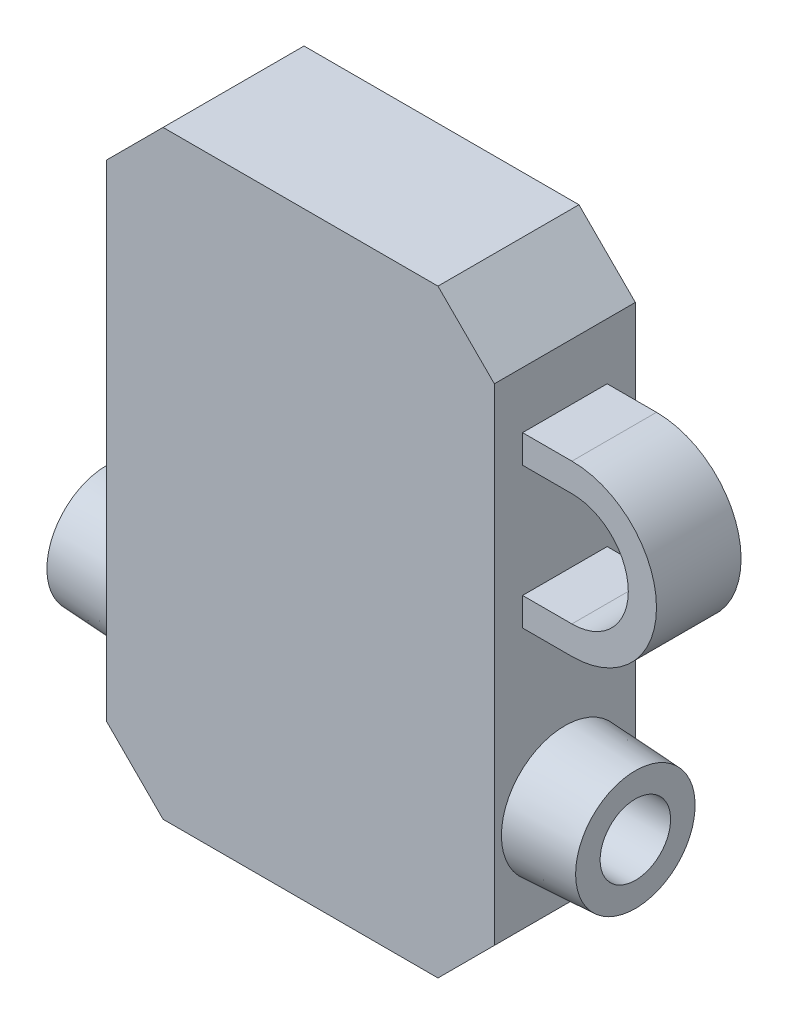
ISO-10303-21;
HEADER;
FILE_DESCRIPTION(('STEP AP214'),'2;1');
FILE_NAME('part.step','',(''),(''),'','','');
FILE_SCHEMA(('AUTOMOTIVE_DESIGN { 1 0 10303 214 1 1 1 1 }'));
ENDSEC;
DATA;
#1=APPLICATION_CONTEXT('core data for automotive mechanical design processes');
#2=APPLICATION_PROTOCOL_DEFINITION('international standard','automotive_design',2000,#1);
#3=PRODUCT_CONTEXT('',#1,'mechanical');
#4=PRODUCT('Part','Part','',(#3));
#5=PRODUCT_RELATED_PRODUCT_CATEGORY('part','',(#4));
#6=PRODUCT_DEFINITION_FORMATION('','',#4);
#7=PRODUCT_DEFINITION_CONTEXT('part definition',#1,'design');
#8=PRODUCT_DEFINITION('design','',#6,#7);
#9=PRODUCT_DEFINITION_SHAPE('','',#8);
#10=(LENGTH_UNIT() NAMED_UNIT(*) SI_UNIT(.MILLI.,.METRE.));
#11=(NAMED_UNIT(*) PLANE_ANGLE_UNIT() SI_UNIT($,.RADIAN.));
#12=(NAMED_UNIT(*) SI_UNIT($,.STERADIAN.) SOLID_ANGLE_UNIT());
#13=UNCERTAINTY_MEASURE_WITH_UNIT(LENGTH_MEASURE(1.E-05),#10,'distance_accuracy_value','');
#14=(GEOMETRIC_REPRESENTATION_CONTEXT(3) GLOBAL_UNCERTAINTY_ASSIGNED_CONTEXT((#13)) GLOBAL_UNIT_ASSIGNED_CONTEXT((#10,
#11,#12)) REPRESENTATION_CONTEXT('',''));
#15=CARTESIAN_POINT('',(0.,0.,0.));
#16=DIRECTION('',(0.,0.,1.));
#17=DIRECTION('',(1.,0.,0.));
#18=AXIS2_PLACEMENT_3D('',#15,#16,#17);
#19=CARTESIAN_POINT('',(27.5,4.,10.));
#20=DIRECTION('',(-1.,0.,0.));
#21=DIRECTION('',(0.,0.,1.));
#22=AXIS2_PLACEMENT_3D('',#19,#20,#21);
#23=PLANE('',#22);
#24=DIRECTION('',(0.,1.,0.));
#25=VECTOR('',#24,1.);
#26=CARTESIAN_POINT('',(27.5,4.,2.));
#27=LINE('',#26,#25);
#28=CARTESIAN_POINT('',(27.5,32.5,2.));
#29=VERTEX_POINT('',#28);
#30=CARTESIAN_POINT('',(27.5,34.5,2.));
#31=VERTEX_POINT('',#30);
#32=EDGE_CURVE('E48',#29,#31,#27,.T.);
#33=ORIENTED_EDGE('',*,*,#32,.F.);
#34=DIRECTION('',(0.,0.,1.));
#35=VECTOR('',#34,1.);
#36=CARTESIAN_POINT('',(27.5,32.5,2.));
#37=LINE('',#36,#35);
#38=CARTESIAN_POINT('',(27.5,32.5,8.));
#39=VERTEX_POINT('',#38);
#40=EDGE_CURVE('E169',#29,#39,#37,.T.);
#41=ORIENTED_EDGE('',*,*,#40,.T.);
#42=DIRECTION('',(0.,1.,0.));
#43=VECTOR('',#42,1.);
#44=CARTESIAN_POINT('',(27.5,4.,8.));
#45=LINE('',#44,#43);
#46=CARTESIAN_POINT('',(27.5,34.5,8.));
#47=VERTEX_POINT('',#46);
#48=EDGE_CURVE('E180',#39,#47,#45,.T.);
#49=ORIENTED_EDGE('',*,*,#48,.T.);
#50=DIRECTION('',(0.,0.,-1.));
#51=VECTOR('',#50,1.);
#52=CARTESIAN_POINT('',(27.5,34.5,10.));
#53=LINE('',#52,#51);
#54=EDGE_CURVE('E295',#47,#31,#53,.T.);
#55=ORIENTED_EDGE('',*,*,#54,.T.);
#56=EDGE_LOOP('',(#33,#41,#49,#55));
#57=FACE_BOUND('',#56,.T.);
#58=DIRECTION('',(0.,1.,0.));
#59=VECTOR('',#58,1.);
#60=CARTESIAN_POINT('',(27.5,4.,0.));
#61=LINE('',#60,#59);
#62=CARTESIAN_POINT('',(27.5,4.,0.));
#63=VERTEX_POINT('',#62);
#64=CARTESIAN_POINT('',(27.5,38.5,0.));
#65=VERTEX_POINT('',#64);
#66=EDGE_CURVE('E258',#63,#65,#61,.T.);
#67=ORIENTED_EDGE('',*,*,#66,.T.);
#68=DIRECTION('',(0.,0.,-1.));
#69=VECTOR('',#68,1.);
#70=CARTESIAN_POINT('',(27.5,38.5,10.));
#71=LINE('',#70,#69);
#72=CARTESIAN_POINT('',(27.5,38.5,10.));
#73=VERTEX_POINT('',#72);
#74=EDGE_CURVE('E261',#73,#65,#71,.T.);
#75=ORIENTED_EDGE('',*,*,#74,.F.);
#76=DIRECTION('',(0.,1.,0.));
#77=VECTOR('',#76,1.);
#78=CARTESIAN_POINT('',(27.5,4.,10.));
#79=LINE('',#78,#77);
#80=CARTESIAN_POINT('',(27.5,4.,10.));
#81=VERTEX_POINT('',#80);
#82=EDGE_CURVE('E239',#81,#73,#79,.T.);
#83=ORIENTED_EDGE('',*,*,#82,.F.);
#84=DIRECTION('',(0.,0.,-1.));
#85=VECTOR('',#84,1.);
#86=CARTESIAN_POINT('',(27.5,4.,10.));
#87=LINE('',#86,#85);
#88=EDGE_CURVE('E262',#81,#63,#87,.T.);
#89=ORIENTED_EDGE('',*,*,#88,.T.);
#90=EDGE_LOOP('',(#67,#75,#83,#89));
#91=FACE_BOUND('',#90,.T.);
#92=CARTESIAN_POINT('',(27.5,10.5,5.));
#93=DIRECTION('',(-1.,0.,0.));
#94=DIRECTION('',(0.,0.,1.));
#95=AXIS2_PLACEMENT_3D('',#92,#93,#94);
#96=CIRCLE('',#95,4.5);
#97=CARTESIAN_POINT('',(27.5,10.5,9.5));
#98=VERTEX_POINT('',#97);
#99=EDGE_CURVE('E219',#98,#98,#96,.T.);
#100=ORIENTED_EDGE('',*,*,#99,.T.);
#101=EDGE_LOOP('',(#100));
#102=FACE_BOUND('',#101,.T.);
#103=CARTESIAN_POINT('',(27.5,22.5,2.));
#104=VERTEX_POINT('',#103);
#105=CARTESIAN_POINT('',(27.5,24.5,2.));
#106=VERTEX_POINT('',#105);
#107=EDGE_CURVE('E12',#104,#106,#27,.T.);
#108=ORIENTED_EDGE('',*,*,#107,.F.);
#109=DIRECTION('',(0.,0.,1.));
#110=VECTOR('',#109,1.);
#111=CARTESIAN_POINT('',(27.5,22.5,10.));
#112=LINE('',#111,#110);
#113=CARTESIAN_POINT('',(27.5,22.5,8.));
#114=VERTEX_POINT('',#113);
#115=EDGE_CURVE('E294',#104,#114,#112,.T.);
#116=ORIENTED_EDGE('',*,*,#115,.T.);
#117=CARTESIAN_POINT('',(27.5,24.5,8.));
#118=VERTEX_POINT('',#117);
#119=EDGE_CURVE('E292',#114,#118,#45,.T.);
#120=ORIENTED_EDGE('',*,*,#119,.T.);
#121=DIRECTION('',(0.,0.,1.));
#122=VECTOR('',#121,1.);
#123=CARTESIAN_POINT('',(27.5,24.5,2.));
#124=LINE('',#123,#122);
#125=EDGE_CURVE('E191',#106,#118,#124,.T.);
#126=ORIENTED_EDGE('',*,*,#125,.F.);
#127=EDGE_LOOP('',(#108,#116,#120,#126));
#128=FACE_BOUND('',#127,.T.);
#129=ADVANCED_FACE('F42',(#57,#91,#102,#128),#23,.F.);
#130=CARTESIAN_POINT('',(4.,42.5,10.));
#131=DIRECTION('',(0.,-1.,0.));
#132=DIRECTION('',(0.,0.,-1.));
#133=AXIS2_PLACEMENT_3D('',#130,#131,#132);
#134=PLANE('',#133);
#135=DIRECTION('',(-1.,0.,0.));
#136=VECTOR('',#135,1.);
#137=CARTESIAN_POINT('',(4.,42.5,0.));
#138=LINE('',#137,#136);
#139=CARTESIAN_POINT('',(23.5,42.5,0.));
#140=VERTEX_POINT('',#139);
#141=CARTESIAN_POINT('',(4.,42.5,0.));
#142=VERTEX_POINT('',#141);
#143=EDGE_CURVE('E218',#140,#142,#138,.T.);
#144=ORIENTED_EDGE('',*,*,#143,.T.);
#145=DIRECTION('',(0.,0.,-1.));
#146=VECTOR('',#145,1.);
#147=CARTESIAN_POINT('',(4.,42.5,10.));
#148=LINE('',#147,#146);
#149=CARTESIAN_POINT('',(4.,42.5,10.));
#150=VERTEX_POINT('',#149);
#151=EDGE_CURVE('E276',#150,#142,#148,.T.);
#152=ORIENTED_EDGE('',*,*,#151,.F.);
#153=DIRECTION('',(-1.,0.,0.));
#154=VECTOR('',#153,1.);
#155=CARTESIAN_POINT('',(4.,42.5,10.));
#156=LINE('',#155,#154);
#157=CARTESIAN_POINT('',(23.5,42.5,10.));
#158=VERTEX_POINT('',#157);
#159=EDGE_CURVE('E223',#158,#150,#156,.T.);
#160=ORIENTED_EDGE('',*,*,#159,.F.);
#161=DIRECTION('',(0.,0.,-1.));
#162=VECTOR('',#161,1.);
#163=CARTESIAN_POINT('',(23.5,42.5,10.));
#164=LINE('',#163,#162);
#165=EDGE_CURVE('E244',#158,#140,#164,.T.);
#166=ORIENTED_EDGE('',*,*,#165,.T.);
#167=EDGE_LOOP('',(#144,#152,#160,#166));
#168=FACE_BOUND('',#167,.T.);
#169=ADVANCED_FACE('F309',(#168),#134,.F.);
#170=CARTESIAN_POINT('',(0.,38.5,10.));
#171=DIRECTION('',(0.707106781186547,-0.707106781186548,0.));
#172=DIRECTION('',(0.707106781186548,0.707106781186547,0.));
#173=AXIS2_PLACEMENT_3D('',#170,#171,#172);
#174=PLANE('',#173);
#175=DIRECTION('',(-0.707106781186548,-0.707106781186547,0.));
#176=VECTOR('',#175,1.);
#177=CARTESIAN_POINT('',(0.,38.5,0.));
#178=LINE('',#177,#176);
#179=CARTESIAN_POINT('',(0.,38.5,0.));
#180=VERTEX_POINT('',#179);
#181=EDGE_CURVE('E248',#142,#180,#178,.T.);
#182=ORIENTED_EDGE('',*,*,#181,.T.);
#183=DIRECTION('',(0.,0.,-1.));
#184=VECTOR('',#183,1.);
#185=CARTESIAN_POINT('',(0.,38.5,10.));
#186=LINE('',#185,#184);
#187=CARTESIAN_POINT('',(0.,38.5,10.));
#188=VERTEX_POINT('',#187);
#189=EDGE_CURVE('E277',#188,#180,#186,.T.);
#190=ORIENTED_EDGE('',*,*,#189,.F.);
#191=DIRECTION('',(-0.707106781186548,-0.707106781186547,0.));
#192=VECTOR('',#191,1.);
#193=CARTESIAN_POINT('',(0.,38.5,10.));
#194=LINE('',#193,#192);
#195=EDGE_CURVE('E229',#150,#188,#194,.T.);
#196=ORIENTED_EDGE('',*,*,#195,.F.);
#197=ORIENTED_EDGE('',*,*,#151,.T.);
#198=EDGE_LOOP('',(#182,#190,#196,#197));
#199=FACE_BOUND('',#198,.T.);
#200=ADVANCED_FACE('F381',(#199),#174,.F.);
#201=CARTESIAN_POINT('',(0.,4.,10.));
#202=DIRECTION('',(1.,0.,0.));
#203=DIRECTION('',(0.,0.,-1.));
#204=AXIS2_PLACEMENT_3D('',#201,#202,#203);
#205=PLANE('',#204);
#206=CARTESIAN_POINT('',(0.,10.5,5.));
#207=DIRECTION('',(1.,0.,0.));
#208=DIRECTION('',(0.,0.,-1.));
#209=AXIS2_PLACEMENT_3D('',#206,#207,#208);
#210=CIRCLE('',#209,4.5);
#211=CARTESIAN_POINT('',(0.,10.5,0.499999999999998));
#212=VERTEX_POINT('',#211);
#213=EDGE_CURVE('E216',#212,#212,#210,.T.);
#214=ORIENTED_EDGE('',*,*,#213,.T.);
#215=EDGE_LOOP('',(#214));
#216=FACE_BOUND('',#215,.T.);
#217=DIRECTION('',(0.,-1.,0.));
#218=VECTOR('',#217,1.);
#219=CARTESIAN_POINT('',(0.,4.,0.));
#220=LINE('',#219,#218);
#221=CARTESIAN_POINT('',(0.,4.,0.));
#222=VERTEX_POINT('',#221);
#223=EDGE_CURVE('E246',#180,#222,#220,.T.);
#224=ORIENTED_EDGE('',*,*,#223,.T.);
#225=DIRECTION('',(0.,0.,-1.));
#226=VECTOR('',#225,1.);
#227=CARTESIAN_POINT('',(0.,4.,10.));
#228=LINE('',#227,#226);
#229=CARTESIAN_POINT('',(0.,4.,10.));
#230=VERTEX_POINT('',#229);
#231=EDGE_CURVE('E272',#230,#222,#228,.T.);
#232=ORIENTED_EDGE('',*,*,#231,.F.);
#233=DIRECTION('',(0.,-1.,0.));
#234=VECTOR('',#233,1.);
#235=CARTESIAN_POINT('',(0.,4.,10.));
#236=LINE('',#235,#234);
#237=EDGE_CURVE('E233',#188,#230,#236,.T.);
#238=ORIENTED_EDGE('',*,*,#237,.F.);
#239=ORIENTED_EDGE('',*,*,#189,.T.);
#240=EDGE_LOOP('',(#224,#232,#238,#239));
#241=FACE_BOUND('',#240,.T.);
#242=ADVANCED_FACE('F380',(#216,#241),#205,.F.);
#243=CARTESIAN_POINT('',(4.,0.,10.));
#244=DIRECTION('',(0.707106781186548,0.707106781186548,0.));
#245=DIRECTION('',(-0.707106781186548,0.707106781186548,0.));
#246=AXIS2_PLACEMENT_3D('',#243,#244,#245);
#247=PLANE('',#246);
#248=DIRECTION('',(0.707106781186548,-0.707106781186548,0.));
#249=VECTOR('',#248,1.);
#250=CARTESIAN_POINT('',(4.,0.,0.));
#251=LINE('',#250,#249);
#252=CARTESIAN_POINT('',(4.,0.,0.));
#253=VERTEX_POINT('',#252);
#254=EDGE_CURVE('E249',#222,#253,#251,.T.);
#255=ORIENTED_EDGE('',*,*,#254,.T.);
#256=DIRECTION('',(0.,0.,-1.));
#257=VECTOR('',#256,1.);
#258=CARTESIAN_POINT('',(4.,0.,10.));
#259=LINE('',#258,#257);
#260=CARTESIAN_POINT('',(4.,0.,10.));
#261=VERTEX_POINT('',#260);
#262=EDGE_CURVE('E269',#261,#253,#259,.T.);
#263=ORIENTED_EDGE('',*,*,#262,.F.);
#264=DIRECTION('',(0.707106781186548,-0.707106781186548,0.));
#265=VECTOR('',#264,1.);
#266=CARTESIAN_POINT('',(4.,0.,10.));
#267=LINE('',#266,#265);
#268=EDGE_CURVE('E231',#230,#261,#267,.T.);
#269=ORIENTED_EDGE('',*,*,#268,.F.);
#270=ORIENTED_EDGE('',*,*,#231,.T.);
#271=EDGE_LOOP('',(#255,#263,#269,#270));
#272=FACE_BOUND('',#271,.T.);
#273=ADVANCED_FACE('F373',(#272),#247,.F.);
#274=CARTESIAN_POINT('',(4.,0.,10.));
#275=DIRECTION('',(0.,1.,0.));
#276=DIRECTION('',(0.,0.,1.));
#277=AXIS2_PLACEMENT_3D('',#274,#275,#276);
#278=PLANE('',#277);
#279=DIRECTION('',(1.,0.,0.));
#280=VECTOR('',#279,1.);
#281=CARTESIAN_POINT('',(4.,0.,0.));
#282=LINE('',#281,#280);
#283=CARTESIAN_POINT('',(23.5,0.,0.));
#284=VERTEX_POINT('',#283);
#285=EDGE_CURVE('E252',#253,#284,#282,.T.);
#286=ORIENTED_EDGE('',*,*,#285,.T.);
#287=DIRECTION('',(0.,0.,-1.));
#288=VECTOR('',#287,1.);
#289=CARTESIAN_POINT('',(23.5,0.,10.));
#290=LINE('',#289,#288);
#291=CARTESIAN_POINT('',(23.5,0.,10.));
#292=VERTEX_POINT('',#291);
#293=EDGE_CURVE('E270',#292,#284,#290,.T.);
#294=ORIENTED_EDGE('',*,*,#293,.F.);
#295=DIRECTION('',(1.,0.,0.));
#296=VECTOR('',#295,1.);
#297=CARTESIAN_POINT('',(4.,0.,10.));
#298=LINE('',#297,#296);
#299=EDGE_CURVE('E234',#261,#292,#298,.T.);
#300=ORIENTED_EDGE('',*,*,#299,.F.);
#301=ORIENTED_EDGE('',*,*,#262,.T.);
#302=EDGE_LOOP('',(#286,#294,#300,#301));
#303=FACE_BOUND('',#302,.T.);
#304=ADVANCED_FACE('F369',(#303),#278,.F.);
#305=CARTESIAN_POINT('',(23.5,0.,10.));
#306=DIRECTION('',(-0.707106781186548,0.707106781186548,0.));
#307=DIRECTION('',(-0.707106781186548,-0.707106781186548,0.));
#308=AXIS2_PLACEMENT_3D('',#305,#306,#307);
#309=PLANE('',#308);
#310=DIRECTION('',(0.707106781186548,0.707106781186548,0.));
#311=VECTOR('',#310,1.);
#312=CARTESIAN_POINT('',(23.5,0.,0.));
#313=LINE('',#312,#311);
#314=EDGE_CURVE('E255',#284,#63,#313,.T.);
#315=ORIENTED_EDGE('',*,*,#314,.T.);
#316=ORIENTED_EDGE('',*,*,#88,.F.);
#317=DIRECTION('',(0.707106781186548,0.707106781186548,0.));
#318=VECTOR('',#317,1.);
#319=CARTESIAN_POINT('',(23.5,0.,10.));
#320=LINE('',#319,#318);
#321=EDGE_CURVE('E240',#292,#81,#320,.T.);
#322=ORIENTED_EDGE('',*,*,#321,.F.);
#323=ORIENTED_EDGE('',*,*,#293,.T.);
#324=EDGE_LOOP('',(#315,#316,#322,#323));
#325=FACE_BOUND('',#324,.T.);
#326=ADVANCED_FACE('F365',(#325),#309,.F.);
#327=CARTESIAN_POINT('',(23.5,42.5,10.));
#328=DIRECTION('',(-0.707106781186547,-0.707106781186548,0.));
#329=DIRECTION('',(0.707106781186548,-0.707106781186547,0.));
#330=AXIS2_PLACEMENT_3D('',#327,#328,#329);
#331=PLANE('',#330);
#332=DIRECTION('',(-0.707106781186548,0.707106781186547,0.));
#333=VECTOR('',#332,1.);
#334=CARTESIAN_POINT('',(23.5,42.5,0.));
#335=LINE('',#334,#333);
#336=EDGE_CURVE('E228',#65,#140,#335,.T.);
#337=ORIENTED_EDGE('',*,*,#336,.T.);
#338=ORIENTED_EDGE('',*,*,#165,.F.);
#339=DIRECTION('',(-0.707106781186548,0.707106781186547,0.));
#340=VECTOR('',#339,1.);
#341=CARTESIAN_POINT('',(23.5,42.5,10.));
#342=LINE('',#341,#340);
#343=EDGE_CURVE('E241',#73,#158,#342,.T.);
#344=ORIENTED_EDGE('',*,*,#343,.F.);
#345=ORIENTED_EDGE('',*,*,#74,.T.);
#346=EDGE_LOOP('',(#337,#338,#344,#345));
#347=FACE_BOUND('',#346,.T.);
#348=ADVANCED_FACE('F356',(#347),#331,.F.);
#349=CARTESIAN_POINT('',(0.,0.,10.));
#350=DIRECTION('',(0.,0.,1.));
#351=DIRECTION('',(1.,0.,0.));
#352=AXIS2_PLACEMENT_3D('',#349,#350,#351);
#353=PLANE('',#352);
#354=ORIENTED_EDGE('',*,*,#159,.T.);
#355=ORIENTED_EDGE('',*,*,#195,.T.);
#356=ORIENTED_EDGE('',*,*,#237,.T.);
#357=ORIENTED_EDGE('',*,*,#268,.T.);
#358=ORIENTED_EDGE('',*,*,#299,.T.);
#359=ORIENTED_EDGE('',*,*,#321,.T.);
#360=ORIENTED_EDGE('',*,*,#82,.T.);
#361=ORIENTED_EDGE('',*,*,#343,.T.);
#362=EDGE_LOOP('',(#354,#355,#356,#357,#358,#359,#360,#361));
#363=FACE_BOUND('',#362,.T.);
#364=ADVANCED_FACE('F353',(#363),#353,.T.);
#365=CARTESIAN_POINT('',(0.,0.,0.));
#366=DIRECTION('',(0.,0.,1.));
#367=DIRECTION('',(1.,0.,0.));
#368=AXIS2_PLACEMENT_3D('',#365,#366,#367);
#369=PLANE('',#368);
#370=ORIENTED_EDGE('',*,*,#143,.F.);
#371=ORIENTED_EDGE('',*,*,#336,.F.);
#372=ORIENTED_EDGE('',*,*,#66,.F.);
#373=ORIENTED_EDGE('',*,*,#314,.F.);
#374=ORIENTED_EDGE('',*,*,#285,.F.);
#375=ORIENTED_EDGE('',*,*,#254,.F.);
#376=ORIENTED_EDGE('',*,*,#223,.F.);
#377=ORIENTED_EDGE('',*,*,#181,.F.);
#378=EDGE_LOOP('',(#370,#371,#372,#373,#374,#375,#376,#377));
#379=FACE_BOUND('',#378,.T.);
#380=ADVANCED_FACE('F360',(#379),#369,.F.);
#381=CARTESIAN_POINT('',(50.2279220613579,10.5,5.));
#382=DIRECTION('',(-1.,0.,0.));
#383=DIRECTION('',(0.,0.,1.));
#384=AXIS2_PLACEMENT_3D('',#381,#382,#383);
#385=CYLINDRICAL_SURFACE('',#384,2.5);
#386=CARTESIAN_POINT('',(32.5,10.5,5.));
#387=DIRECTION('',(-1.,0.,0.));
#388=DIRECTION('',(0.,0.,1.));
#389=AXIS2_PLACEMENT_3D('',#386,#387,#388);
#390=CIRCLE('',#389,2.5);
#391=CARTESIAN_POINT('',(32.5,10.5,7.5));
#392=VERTEX_POINT('',#391);
#393=EDGE_CURVE('E215',#392,#392,#390,.F.);
#394=CARTESIAN_POINT('',(27.5,10.5,5.));
#395=DIRECTION('',(-1.,0.,0.));
#396=DIRECTION('',(0.,0.,1.));
#397=AXIS2_PLACEMENT_3D('',#394,#395,#396);
#398=CIRCLE('',#397,2.5);
#399=CARTESIAN_POINT('',(27.5,10.5,7.5));
#400=VERTEX_POINT('',#399);
#401=EDGE_CURVE('E221',#400,#400,#398,.T.);
#402=CARTESIAN_POINT('',(32.5,10.5,7.5));
#403=CARTESIAN_POINT('',(32.4479166666667,10.5,7.5));
#404=CARTESIAN_POINT('',(32.3958333333333,10.5,7.5));
#405=CARTESIAN_POINT('',(32.2916666666667,10.5,7.5));
#406=CARTESIAN_POINT('',(32.2395833333333,10.5,7.5));
#407=CARTESIAN_POINT('',(32.1354166666667,10.5,7.5));
#408=CARTESIAN_POINT('',(32.0833333333333,10.5,7.5));
#409=CARTESIAN_POINT('',(31.9791666666667,10.5,7.5));
#410=CARTESIAN_POINT('',(31.9270833333333,10.5,7.5));
#411=CARTESIAN_POINT('',(31.8229166666667,10.5,7.5));
#412=CARTESIAN_POINT('',(31.7708333333333,10.5,7.5));
#413=CARTESIAN_POINT('',(31.6666666666667,10.5,7.5));
#414=CARTESIAN_POINT('',(31.6145833333333,10.5,7.5));
#415=CARTESIAN_POINT('',(31.5104166666667,10.5,7.5));
#416=CARTESIAN_POINT('',(31.4583333333333,10.5,7.5));
#417=CARTESIAN_POINT('',(31.3541666666667,10.5,7.5));
#418=CARTESIAN_POINT('',(31.3020833333333,10.5,7.5));
#419=CARTESIAN_POINT('',(31.1979166666667,10.5,7.5));
#420=CARTESIAN_POINT('',(31.1458333333333,10.5,7.5));
#421=CARTESIAN_POINT('',(31.0416666666667,10.5,7.5));
#422=CARTESIAN_POINT('',(30.9895833333333,10.5,7.5));
#423=CARTESIAN_POINT('',(30.8854166666667,10.5,7.5));
#424=CARTESIAN_POINT('',(30.8333333333333,10.5,7.5));
#425=CARTESIAN_POINT('',(30.7291666666667,10.5,7.5));
#426=CARTESIAN_POINT('',(30.6770833333333,10.5,7.5));
#427=CARTESIAN_POINT('',(30.5729166666667,10.5,7.5));
#428=CARTESIAN_POINT('',(30.5208333333333,10.5,7.5));
#429=CARTESIAN_POINT('',(30.4166666666667,10.5,7.5));
#430=CARTESIAN_POINT('',(30.3645833333333,10.5,7.5));
#431=CARTESIAN_POINT('',(30.2604166666667,10.5,7.5));
#432=CARTESIAN_POINT('',(30.2083333333333,10.5,7.5));
#433=CARTESIAN_POINT('',(30.1041666666667,10.5,7.5));
#434=CARTESIAN_POINT('',(30.0520833333333,10.5,7.5));
#435=CARTESIAN_POINT('',(29.9479166666667,10.5,7.5));
#436=CARTESIAN_POINT('',(29.8958333333333,10.5,7.5));
#437=CARTESIAN_POINT('',(29.7916666666667,10.5,7.5));
#438=CARTESIAN_POINT('',(29.7395833333333,10.5,7.5));
#439=CARTESIAN_POINT('',(29.6354166666667,10.5,7.5));
#440=CARTESIAN_POINT('',(29.5833333333333,10.5,7.5));
#441=CARTESIAN_POINT('',(29.4791666666667,10.5,7.5));
#442=CARTESIAN_POINT('',(29.4270833333333,10.5,7.5));
#443=CARTESIAN_POINT('',(29.3229166666667,10.5,7.5));
#444=CARTESIAN_POINT('',(29.2708333333333,10.5,7.5));
#445=CARTESIAN_POINT('',(29.1666666666667,10.5,7.5));
#446=CARTESIAN_POINT('',(29.1145833333333,10.5,7.5));
#447=CARTESIAN_POINT('',(29.0104166666667,10.5,7.5));
#448=CARTESIAN_POINT('',(28.9583333333333,10.5,7.5));
#449=CARTESIAN_POINT('',(28.8541666666667,10.5,7.5));
#450=CARTESIAN_POINT('',(28.8020833333333,10.5,7.5));
#451=CARTESIAN_POINT('',(28.6979166666667,10.5,7.5));
#452=CARTESIAN_POINT('',(28.6458333333333,10.5,7.5));
#453=CARTESIAN_POINT('',(28.5416666666667,10.5,7.5));
#454=CARTESIAN_POINT('',(28.4895833333333,10.5,7.5));
#455=CARTESIAN_POINT('',(28.3854166666667,10.5,7.5));
#456=CARTESIAN_POINT('',(28.3333333333333,10.5,7.5));
#457=CARTESIAN_POINT('',(28.2291666666667,10.5,7.5));
#458=CARTESIAN_POINT('',(28.1770833333333,10.5,7.5));
#459=CARTESIAN_POINT('',(28.0729166666667,10.5,7.5));
#460=CARTESIAN_POINT('',(28.0208333333333,10.5,7.5));
#461=CARTESIAN_POINT('',(27.9166666666667,10.5,7.5));
#462=CARTESIAN_POINT('',(27.8645833333333,10.5,7.5));
#463=CARTESIAN_POINT('',(27.7604166666667,10.5,7.5));
#464=CARTESIAN_POINT('',(27.7083333333333,10.5,7.5));
#465=CARTESIAN_POINT('',(27.6041666666667,10.5,7.5));
#466=CARTESIAN_POINT('',(27.5520833333333,10.5,7.5));
#467=CARTESIAN_POINT('',(27.5,10.5,7.5));
#468=B_SPLINE_CURVE_WITH_KNOTS('',3,(#402,#403,#404,#405,#406,#407,#408,#409,#410,#411,#412,
#413,#414,#415,#416,#417,#418,#419,#420,#421,#422,#423,#424,#425,#426,#427,#428,#429,#430,#431,
#432,#433,#434,#435,#436,#437,#438,#439,#440,#441,#442,#443,#444,#445,#446,#447,#448,#449,#450,
#451,#452,#453,#454,#455,#456,#457,#458,#459,#460,#461,#462,#463,#464,#465,#466,#467),
.UNSPECIFIED.,.F.,.F.,(4,2,2,2,2,2,2,2,2,2,2,2,2,2,2,2,2,2,2,2,2,2,2,2,2,2,2,2,2,2,2,2,4),(0.,
0.156249999999997,0.312499999999993,0.468749999999997,0.625000000000001,0.781249999999997,
0.937499999999994,1.09375,1.25,1.40624999999999,1.56249999999999,1.71874999999999,
1.87499999999999,2.03124999999999,2.1875,2.34375,2.5,2.65625,2.8125,2.96875,3.125,3.28125,
3.4375,3.59375,3.74999999999999,3.90625,4.06249999999999,4.21874999999999,4.37499999999999,
4.53124999999999,4.68749999999999,4.84374999999999,4.99999999999999),.UNSPECIFIED.);
#469=EDGE_CURVE('BSEAM346',#392,#400,#468,.T.);
#470=ORIENTED_EDGE('',*,*,#393,.T.);
#471=ORIENTED_EDGE('',*,*,#401,.T.);
#472=ORIENTED_EDGE('',*,*,#469,.T.);
#473=ORIENTED_EDGE('',*,*,#469,.F.);
#474=EDGE_LOOP('',(#470,#472,#471,#473));
#475=FACE_BOUND('',#474,.T.);
#476=ADVANCED_FACE('F346',(#475),#385,.F.);
#477=CARTESIAN_POINT('',(32.5,4.,10.));
#478=DIRECTION('',(-1.,0.,0.));
#479=DIRECTION('',(0.,0.,1.));
#480=AXIS2_PLACEMENT_3D('',#477,#478,#479);
#481=PLANE('',#480);
#482=CARTESIAN_POINT('',(32.5,10.5,5.));
#483=DIRECTION('',(-1.,0.,0.));
#484=DIRECTION('',(0.,0.,1.));
#485=AXIS2_PLACEMENT_3D('',#482,#483,#484);
#486=CIRCLE('',#485,4.2379611035848);
#487=CARTESIAN_POINT('',(32.5,10.5,9.2379611035848));
#488=VERTEX_POINT('',#487);
#489=EDGE_CURVE('E214',#488,#488,#486,.F.);
#490=ORIENTED_EDGE('',*,*,#489,.T.);
#491=EDGE_LOOP('',(#490));
#492=FACE_BOUND('',#491,.T.);
#493=ORIENTED_EDGE('',*,*,#393,.F.);
#494=EDGE_LOOP('',(#493));
#495=FACE_BOUND('',#494,.T.);
#496=ADVANCED_FACE('F349',(#492,#495),#481,.F.);
#497=CARTESIAN_POINT('',(27.5,10.5,5.));
#498=DIRECTION('',(-1.,0.,0.));
#499=DIRECTION('',(0.,0.,1.));
#500=AXIS2_PLACEMENT_3D('',#497,#498,#499);
#501=CONICAL_SURFACE('',#500,4.5,0.0523598775598299);
#502=ORIENTED_EDGE('',*,*,#489,.F.);
#503=EDGE_LOOP('',(#502));
#504=FACE_BOUND('',#503,.T.);
#505=ORIENTED_EDGE('',*,*,#99,.F.);
#506=EDGE_LOOP('',(#505));
#507=FACE_BOUND('',#506,.T.);
#508=ADVANCED_FACE('F352',(#504,#507),#501,.T.);
#509=ORIENTED_EDGE('',*,*,#401,.F.);
#510=EDGE_LOOP('',(#509));
#511=FACE_BOUND('',#510,.T.);
#512=ADVANCED_FACE('F315',(#511),#23,.F.);
#513=CARTESIAN_POINT('',(-5.,10.5,5.));
#514=DIRECTION('',(-1.,0.,0.));
#515=DIRECTION('',(0.,0.,1.));
#516=AXIS2_PLACEMENT_3D('',#513,#514,#515);
#517=CIRCLE('',#516,2.5);
#518=CARTESIAN_POINT('',(-5.,10.5,7.5));
#519=VERTEX_POINT('',#518);
#520=EDGE_CURVE('E210',#519,#519,#517,.T.);
#521=CARTESIAN_POINT('',(0.,10.5,5.));
#522=DIRECTION('',(1.,0.,0.));
#523=DIRECTION('',(0.,0.,-1.));
#524=AXIS2_PLACEMENT_3D('',#521,#522,#523);
#525=CIRCLE('',#524,2.5);
#526=CARTESIAN_POINT('',(0.,10.5,7.5));
#527=VERTEX_POINT('',#526);
#528=EDGE_CURVE('E222',#527,#527,#525,.T.);
#529=CARTESIAN_POINT('',(-5.,10.5,7.5));
#530=CARTESIAN_POINT('',(-4.94791666666667,10.5,7.5));
#531=CARTESIAN_POINT('',(-4.89583333333334,10.5,7.5));
#532=CARTESIAN_POINT('',(-4.79166666666667,10.5,7.5));
#533=CARTESIAN_POINT('',(-4.73958333333334,10.5,7.5));
#534=CARTESIAN_POINT('',(-4.63541666666667,10.5,7.5));
#535=CARTESIAN_POINT('',(-4.58333333333333,10.5,7.5));
#536=CARTESIAN_POINT('',(-4.47916666666667,10.5,7.5));
#537=CARTESIAN_POINT('',(-4.42708333333334,10.5,7.5));
#538=CARTESIAN_POINT('',(-4.32291666666667,10.5,7.5));
#539=CARTESIAN_POINT('',(-4.27083333333334,10.5,7.5));
#540=CARTESIAN_POINT('',(-4.16666666666667,10.5,7.5));
#541=CARTESIAN_POINT('',(-4.11458333333334,10.5,7.5));
#542=CARTESIAN_POINT('',(-4.01041666666667,10.5,7.5));
#543=CARTESIAN_POINT('',(-3.95833333333333,10.5,7.5));
#544=CARTESIAN_POINT('',(-3.85416666666667,10.5,7.5));
#545=CARTESIAN_POINT('',(-3.80208333333334,10.5,7.5));
#546=CARTESIAN_POINT('',(-3.69791666666667,10.5,7.5));
#547=CARTESIAN_POINT('',(-3.64583333333334,10.5,7.5));
#548=CARTESIAN_POINT('',(-3.54166666666667,10.5,7.5));
#549=CARTESIAN_POINT('',(-3.48958333333334,10.5,7.5));
#550=CARTESIAN_POINT('',(-3.38541666666667,10.5,7.5));
#551=CARTESIAN_POINT('',(-3.33333333333333,10.5,7.5));
#552=CARTESIAN_POINT('',(-3.22916666666667,10.5,7.5));
#553=CARTESIAN_POINT('',(-3.17708333333334,10.5,7.5));
#554=CARTESIAN_POINT('',(-3.07291666666667,10.5,7.5));
#555=CARTESIAN_POINT('',(-3.02083333333334,10.5,7.5));
#556=CARTESIAN_POINT('',(-2.91666666666667,10.5,7.5));
#557=CARTESIAN_POINT('',(-2.86458333333334,10.5,7.5));
#558=CARTESIAN_POINT('',(-2.76041666666667,10.5,7.5));
#559=CARTESIAN_POINT('',(-2.70833333333333,10.5,7.5));
#560=CARTESIAN_POINT('',(-2.60416666666667,10.5,7.5));
#561=CARTESIAN_POINT('',(-2.55208333333333,10.5,7.5));
#562=CARTESIAN_POINT('',(-2.44791666666667,10.5,7.5));
#563=CARTESIAN_POINT('',(-2.39583333333334,10.5,7.5));
#564=CARTESIAN_POINT('',(-2.29166666666667,10.5,7.5));
#565=CARTESIAN_POINT('',(-2.23958333333334,10.5,7.5));
#566=CARTESIAN_POINT('',(-2.13541666666667,10.5,7.5));
#567=CARTESIAN_POINT('',(-2.08333333333333,10.5,7.5));
#568=CARTESIAN_POINT('',(-1.97916666666667,10.5,7.5));
#569=CARTESIAN_POINT('',(-1.92708333333333,10.5,7.5));
#570=CARTESIAN_POINT('',(-1.82291666666667,10.5,7.5));
#571=CARTESIAN_POINT('',(-1.77083333333334,10.5,7.5));
#572=CARTESIAN_POINT('',(-1.66666666666667,10.5,7.5));
#573=CARTESIAN_POINT('',(-1.61458333333334,10.5,7.5));
#574=CARTESIAN_POINT('',(-1.51041666666667,10.5,7.5));
#575=CARTESIAN_POINT('',(-1.45833333333333,10.5,7.5));
#576=CARTESIAN_POINT('',(-1.35416666666667,10.5,7.5));
#577=CARTESIAN_POINT('',(-1.30208333333333,10.5,7.5));
#578=CARTESIAN_POINT('',(-1.19791666666667,10.5,7.5));
#579=CARTESIAN_POINT('',(-1.14583333333334,10.5,7.5));
#580=CARTESIAN_POINT('',(-1.04166666666667,10.5,7.5));
#581=CARTESIAN_POINT('',(-0.989583333333335,10.5,7.5));
#582=CARTESIAN_POINT('',(-0.885416666666666,10.5,7.5));
#583=CARTESIAN_POINT('',(-0.833333333333332,10.5,7.5));
#584=CARTESIAN_POINT('',(-0.729166666666665,10.5,7.5));
#585=CARTESIAN_POINT('',(-0.677083333333333,10.5,7.5));
#586=CARTESIAN_POINT('',(-0.572916666666668,10.5,7.5));
#587=CARTESIAN_POINT('',(-0.520833333333336,10.5,7.5));
#588=CARTESIAN_POINT('',(-0.416666666666669,10.5,7.5));
#589=CARTESIAN_POINT('',(-0.364583333333335,10.5,7.5));
#590=CARTESIAN_POINT('',(-0.260416666666666,10.5,7.5));
#591=CARTESIAN_POINT('',(-0.208333333333331,10.5,7.5));
#592=CARTESIAN_POINT('',(-0.104166666666664,10.5,7.5));
#593=CARTESIAN_POINT('',(-0.0520833333333322,10.5,7.5));
#594=CARTESIAN_POINT('',(0.,10.5,7.5));
#595=B_SPLINE_CURVE_WITH_KNOTS('',3,(#529,#530,#531,#532,#533,#534,#535,#536,#537,#538,#539,
#540,#541,#542,#543,#544,#545,#546,#547,#548,#549,#550,#551,#552,#553,#554,#555,#556,#557,#558,
#559,#560,#561,#562,#563,#564,#565,#566,#567,#568,#569,#570,#571,#572,#573,#574,#575,#576,#577,
#578,#579,#580,#581,#582,#583,#584,#585,#586,#587,#588,#589,#590,#591,#592,#593,#594),
.UNSPECIFIED.,.F.,.F.,(4,2,2,2,2,2,2,2,2,2,2,2,2,2,2,2,2,2,2,2,2,2,2,2,2,2,2,2,2,2,2,2,4),(0.,
0.156249999999997,0.3125,0.468750000000004,0.625000000000001,0.781249999999997,
0.937500000000001,1.09375,1.25,1.40625,1.5625,1.71875,1.875,2.03125,2.1875,2.34375000000001,2.5,
2.65625,2.8125,2.96875000000001,3.125,3.28125,3.4375,3.59375000000001,3.75,3.90625,4.0625,
4.21875000000001,4.375,4.53125,4.6875,4.84375000000001,5.),.UNSPECIFIED.);
#596=EDGE_CURVE('BSEAM342',#519,#527,#595,.T.);
#597=ORIENTED_EDGE('',*,*,#520,.T.);
#598=ORIENTED_EDGE('',*,*,#528,.T.);
#599=ORIENTED_EDGE('',*,*,#596,.T.);
#600=ORIENTED_EDGE('',*,*,#596,.F.);
#601=EDGE_LOOP('',(#597,#599,#598,#600));
#602=FACE_BOUND('',#601,.T.);
#603=ADVANCED_FACE('F342',(#602),#385,.F.);
#604=CARTESIAN_POINT('',(0.,10.5,5.));
#605=DIRECTION('',(1.,0.,0.));
#606=DIRECTION('',(0.,0.,-1.));
#607=AXIS2_PLACEMENT_3D('',#604,#605,#606);
#608=CONICAL_SURFACE('',#607,4.5,0.0523598775598299);
#609=CARTESIAN_POINT('',(-5.,10.5,5.));
#610=DIRECTION('',(-1.,0.,0.));
#611=DIRECTION('',(0.,0.,1.));
#612=AXIS2_PLACEMENT_3D('',#609,#610,#611);
#613=CIRCLE('',#612,4.2379611035848);
#614=CARTESIAN_POINT('',(-5.,10.5,9.2379611035848));
#615=VERTEX_POINT('',#614);
#616=EDGE_CURVE('E211',#615,#615,#613,.T.);
#617=ORIENTED_EDGE('',*,*,#616,.F.);
#618=EDGE_LOOP('',(#617));
#619=FACE_BOUND('',#618,.T.);
#620=ORIENTED_EDGE('',*,*,#213,.F.);
#621=EDGE_LOOP('',(#620));
#622=FACE_BOUND('',#621,.T.);
#623=ADVANCED_FACE('F46',(#619,#622),#608,.T.);
#624=CARTESIAN_POINT('',(-5.,0.,0.));
#625=DIRECTION('',(-1.,0.,0.));
#626=DIRECTION('',(0.,0.,1.));
#627=AXIS2_PLACEMENT_3D('',#624,#625,#626);
#628=PLANE('',#627);
#629=ORIENTED_EDGE('',*,*,#520,.F.);
#630=EDGE_LOOP('',(#629));
#631=FACE_BOUND('',#630,.T.);
#632=ORIENTED_EDGE('',*,*,#616,.T.);
#633=EDGE_LOOP('',(#632));
#634=FACE_BOUND('',#633,.T.);
#635=ADVANCED_FACE('F338',(#631,#634),#628,.T.);
#636=ORIENTED_EDGE('',*,*,#528,.F.);
#637=EDGE_LOOP('',(#636));
#638=FACE_BOUND('',#637,.T.);
#639=ADVANCED_FACE('F345',(#638),#205,.F.);
#640=CARTESIAN_POINT('',(25.5,22.5,2.));
#641=DIRECTION('',(0.,-1.,0.));
#642=DIRECTION('',(0.,0.,-1.));
#643=AXIS2_PLACEMENT_3D('',#640,#641,#642);
#644=PLANE('',#643);
#645=ORIENTED_EDGE('',*,*,#115,.F.);
#646=DIRECTION('',(1.,0.,0.));
#647=VECTOR('',#646,1.);
#648=CARTESIAN_POINT('',(25.5,22.5,2.));
#649=LINE('',#648,#647);
#650=CARTESIAN_POINT('',(31.,22.5,2.));
#651=VERTEX_POINT('',#650);
#652=EDGE_CURVE('E203',#104,#651,#649,.T.);
#653=ORIENTED_EDGE('',*,*,#652,.T.);
#654=DIRECTION('',(0.,0.,1.));
#655=VECTOR('',#654,1.);
#656=CARTESIAN_POINT('',(31.,22.5,2.));
#657=LINE('',#656,#655);
#658=CARTESIAN_POINT('',(31.,22.5,8.));
#659=VERTEX_POINT('',#658);
#660=EDGE_CURVE('E204',#651,#659,#657,.T.);
#661=ORIENTED_EDGE('',*,*,#660,.T.);
#662=DIRECTION('',(1.,0.,0.));
#663=VECTOR('',#662,1.);
#664=CARTESIAN_POINT('',(25.5,22.5,8.));
#665=LINE('',#664,#663);
#666=EDGE_CURVE('E184',#114,#659,#665,.T.);
#667=ORIENTED_EDGE('',*,*,#666,.F.);
#668=EDGE_LOOP('',(#645,#653,#661,#667));
#669=FACE_BOUND('',#668,.T.);
#670=ADVANCED_FACE('F323',(#669),#644,.T.);
#671=CARTESIAN_POINT('',(31.,34.5,2.));
#672=DIRECTION('',(0.,1.,0.));
#673=DIRECTION('',(0.,0.,1.));
#674=AXIS2_PLACEMENT_3D('',#671,#672,#673);
#675=PLANE('',#674);
#676=ORIENTED_EDGE('',*,*,#54,.F.);
#677=DIRECTION('',(-1.,0.,0.));
#678=VECTOR('',#677,1.);
#679=CARTESIAN_POINT('',(31.,34.5,8.));
#680=LINE('',#679,#678);
#681=CARTESIAN_POINT('',(31.,34.5,8.));
#682=VERTEX_POINT('',#681);
#683=EDGE_CURVE('E68',#682,#47,#680,.T.);
#684=ORIENTED_EDGE('',*,*,#683,.F.);
#685=DIRECTION('',(0.,0.,1.));
#686=VECTOR('',#685,1.);
#687=CARTESIAN_POINT('',(31.,34.5,2.));
#688=LINE('',#687,#686);
#689=CARTESIAN_POINT('',(31.,34.5,2.));
#690=VERTEX_POINT('',#689);
#691=EDGE_CURVE('E201',#690,#682,#688,.T.);
#692=ORIENTED_EDGE('',*,*,#691,.F.);
#693=DIRECTION('',(-1.,0.,0.));
#694=VECTOR('',#693,1.);
#695=CARTESIAN_POINT('',(31.,34.5,2.));
#696=LINE('',#695,#694);
#697=EDGE_CURVE('E196',#690,#31,#696,.T.);
#698=ORIENTED_EDGE('',*,*,#697,.T.);
#699=EDGE_LOOP('',(#676,#684,#692,#698));
#700=FACE_BOUND('',#699,.T.);
#701=ADVANCED_FACE('F307',(#700),#675,.T.);
#702=CARTESIAN_POINT('',(31.,28.5,2.));
#703=DIRECTION('',(0.,0.,1.));
#704=DIRECTION('',(1.,0.,0.));
#705=AXIS2_PLACEMENT_3D('',#702,#703,#704);
#706=PLANE('',#705);
#707=ORIENTED_EDGE('',*,*,#652,.F.);
#708=ORIENTED_EDGE('',*,*,#107,.T.);
#709=DIRECTION('',(1.,0.,0.));
#710=VECTOR('',#709,1.);
#711=CARTESIAN_POINT('',(27.5,24.5,2.));
#712=LINE('',#711,#710);
#713=CARTESIAN_POINT('',(31.,24.5,2.));
#714=VERTEX_POINT('',#713);
#715=EDGE_CURVE('E166',#106,#714,#712,.T.);
#716=ORIENTED_EDGE('',*,*,#715,.T.);
#717=CARTESIAN_POINT('',(31.,28.5,2.));
#718=DIRECTION('',(0.,0.,1.));
#719=DIRECTION('',(1.,0.,0.));
#720=AXIS2_PLACEMENT_3D('',#717,#718,#719);
#721=CIRCLE('',#720,4.);
#722=CARTESIAN_POINT('',(31.,32.5,2.));
#723=VERTEX_POINT('',#722);
#724=EDGE_CURVE('E186',#714,#723,#721,.T.);
#725=ORIENTED_EDGE('',*,*,#724,.T.);
#726=DIRECTION('',(-1.,0.,0.));
#727=VECTOR('',#726,1.);
#728=CARTESIAN_POINT('',(31.,32.5,2.));
#729=LINE('',#728,#727);
#730=EDGE_CURVE('E163',#723,#29,#729,.T.);
#731=ORIENTED_EDGE('',*,*,#730,.T.);
#732=ORIENTED_EDGE('',*,*,#32,.T.);
#733=ORIENTED_EDGE('',*,*,#697,.F.);
#734=CARTESIAN_POINT('',(31.,28.5,2.));
#735=DIRECTION('',(0.,0.,1.));
#736=DIRECTION('',(1.,0.,0.));
#737=AXIS2_PLACEMENT_3D('',#734,#735,#736);
#738=CIRCLE('',#737,6.);
#739=EDGE_CURVE('E195',#651,#690,#738,.T.);
#740=ORIENTED_EDGE('',*,*,#739,.F.);
#741=EDGE_LOOP('',(#707,#708,#716,#725,#731,#732,#733,#740));
#742=FACE_BOUND('',#741,.T.);
#743=ADVANCED_FACE('F301',(#742),#706,.F.);
#744=CARTESIAN_POINT('',(31.,28.5,8.));
#745=DIRECTION('',(0.,0.,1.));
#746=DIRECTION('',(1.,0.,0.));
#747=AXIS2_PLACEMENT_3D('',#744,#745,#746);
#748=PLANE('',#747);
#749=ORIENTED_EDGE('',*,*,#119,.F.);
#750=ORIENTED_EDGE('',*,*,#666,.T.);
#751=CARTESIAN_POINT('',(31.,28.5,8.));
#752=DIRECTION('',(0.,0.,1.));
#753=DIRECTION('',(1.,0.,0.));
#754=AXIS2_PLACEMENT_3D('',#751,#752,#753);
#755=CIRCLE('',#754,6.);
#756=EDGE_CURVE('E177',#659,#682,#755,.T.);
#757=ORIENTED_EDGE('',*,*,#756,.T.);
#758=ORIENTED_EDGE('',*,*,#683,.T.);
#759=ORIENTED_EDGE('',*,*,#48,.F.);
#760=DIRECTION('',(-1.,0.,0.));
#761=VECTOR('',#760,1.);
#762=CARTESIAN_POINT('',(31.,32.5,8.));
#763=LINE('',#762,#761);
#764=CARTESIAN_POINT('',(31.,32.5,8.));
#765=VERTEX_POINT('',#764);
#766=EDGE_CURVE('E161',#765,#39,#763,.T.);
#767=ORIENTED_EDGE('',*,*,#766,.F.);
#768=CARTESIAN_POINT('',(31.,28.5,8.));
#769=DIRECTION('',(0.,0.,1.));
#770=DIRECTION('',(1.,0.,0.));
#771=AXIS2_PLACEMENT_3D('',#768,#769,#770);
#772=CIRCLE('',#771,4.);
#773=CARTESIAN_POINT('',(31.,24.5,8.));
#774=VERTEX_POINT('',#773);
#775=EDGE_CURVE('E171',#774,#765,#772,.T.);
#776=ORIENTED_EDGE('',*,*,#775,.F.);
#777=DIRECTION('',(1.,0.,0.));
#778=VECTOR('',#777,1.);
#779=CARTESIAN_POINT('',(27.5,24.5,8.));
#780=LINE('',#779,#778);
#781=EDGE_CURVE('E56',#118,#774,#780,.T.);
#782=ORIENTED_EDGE('',*,*,#781,.F.);
#783=EDGE_LOOP('',(#749,#750,#757,#758,#759,#767,#776,#782));
#784=FACE_BOUND('',#783,.T.);
#785=ADVANCED_FACE('F175',(#784),#748,.T.);
#786=CARTESIAN_POINT('',(31.,28.5,2.));
#787=DIRECTION('',(0.,0.,1.));
#788=DIRECTION('',(1.,0.,0.));
#789=AXIS2_PLACEMENT_3D('',#786,#787,#788);
#790=CYLINDRICAL_SURFACE('',#789,6.);
#791=ORIENTED_EDGE('',*,*,#691,.T.);
#792=ORIENTED_EDGE('',*,*,#756,.F.);
#793=ORIENTED_EDGE('',*,*,#660,.F.);
#794=ORIENTED_EDGE('',*,*,#739,.T.);
#795=EDGE_LOOP('',(#791,#792,#793,#794));
#796=FACE_BOUND('',#795,.T.);
#797=ADVANCED_FACE('F330',(#796),#790,.T.);
#798=CARTESIAN_POINT('',(31.,28.5,2.));
#799=DIRECTION('',(0.,0.,1.));
#800=DIRECTION('',(1.,0.,0.));
#801=AXIS2_PLACEMENT_3D('',#798,#799,#800);
#802=CYLINDRICAL_SURFACE('',#801,4.);
#803=DIRECTION('',(0.,0.,1.));
#804=VECTOR('',#803,1.);
#805=CARTESIAN_POINT('',(31.,24.5,2.));
#806=LINE('',#805,#804);
#807=EDGE_CURVE('E174',#714,#774,#806,.T.);
#808=ORIENTED_EDGE('',*,*,#807,.T.);
#809=ORIENTED_EDGE('',*,*,#775,.T.);
#810=DIRECTION('',(0.,0.,1.));
#811=VECTOR('',#810,1.);
#812=CARTESIAN_POINT('',(31.,32.5,2.));
#813=LINE('',#812,#811);
#814=EDGE_CURVE('E160',#723,#765,#813,.T.);
#815=ORIENTED_EDGE('',*,*,#814,.F.);
#816=ORIENTED_EDGE('',*,*,#724,.F.);
#817=EDGE_LOOP('',(#808,#809,#815,#816));
#818=FACE_BOUND('',#817,.T.);
#819=ADVANCED_FACE('F172',(#818),#802,.F.);
#820=CARTESIAN_POINT('',(27.5,24.5,2.));
#821=DIRECTION('',(0.,-1.,0.));
#822=DIRECTION('',(1.,0.,0.));
#823=AXIS2_PLACEMENT_3D('',#820,#821,#822);
#824=PLANE('',#823);
#825=ORIENTED_EDGE('',*,*,#125,.T.);
#826=ORIENTED_EDGE('',*,*,#781,.T.);
#827=ORIENTED_EDGE('',*,*,#807,.F.);
#828=ORIENTED_EDGE('',*,*,#715,.F.);
#829=EDGE_LOOP('',(#825,#826,#827,#828));
#830=FACE_BOUND('',#829,.T.);
#831=ADVANCED_FACE('F319',(#830),#824,.F.);
#832=CARTESIAN_POINT('',(31.,32.5,2.));
#833=DIRECTION('',(0.,1.,0.));
#834=DIRECTION('',(0.,0.,1.));
#835=AXIS2_PLACEMENT_3D('',#832,#833,#834);
#836=PLANE('',#835);
#837=ORIENTED_EDGE('',*,*,#814,.T.);
#838=ORIENTED_EDGE('',*,*,#766,.T.);
#839=ORIENTED_EDGE('',*,*,#40,.F.);
#840=ORIENTED_EDGE('',*,*,#730,.F.);
#841=EDGE_LOOP('',(#837,#838,#839,#840));
#842=FACE_BOUND('',#841,.T.);
#843=ADVANCED_FACE('F157',(#842),#836,.F.);
#844=CLOSED_SHELL('',(#129,#169,#200,#242,#273,#304,#326,#348,#364,#380,#476,#496,#508,#512,
#603,#623,#635,#639,#670,#701,#743,#785,#797,#819,#831,#843));
#845=MANIFOLD_SOLID_BREP('B2',#844);
#846=ADVANCED_BREP_SHAPE_REPRESENTATION('',(#18,#845),#14);
#847=SHAPE_DEFINITION_REPRESENTATION(#9,#846);
ENDSEC;
END-ISO-10303-21;
